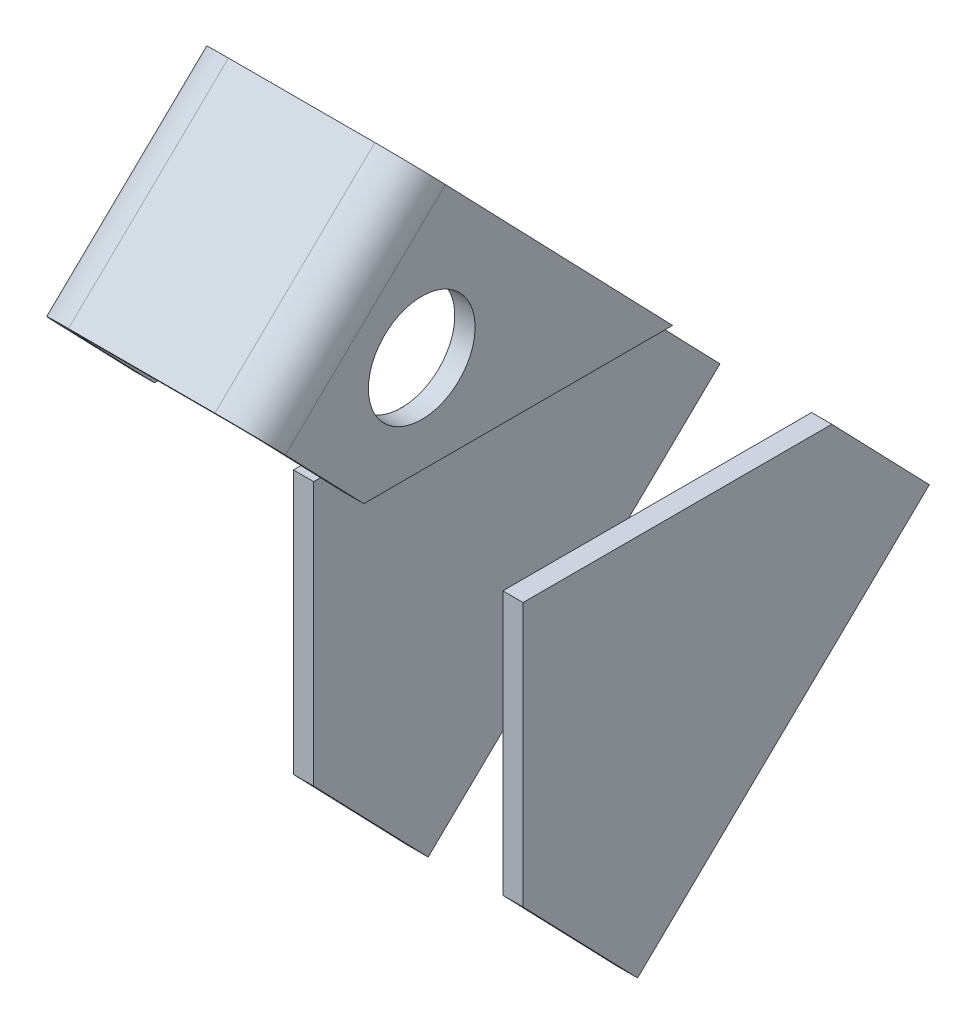
ISO-10303-21;
HEADER;
FILE_DESCRIPTION(('STEP AP214'),'2;1');
FILE_NAME('part.step','',(''),(''),'','','');
FILE_SCHEMA(('AUTOMOTIVE_DESIGN { 1 0 10303 214 1 1 1 1 }'));
ENDSEC;
DATA;
#1=APPLICATION_CONTEXT('core data for automotive mechanical design processes');
#2=APPLICATION_PROTOCOL_DEFINITION('international standard','automotive_design',2000,#1);
#3=PRODUCT_CONTEXT('',#1,'mechanical');
#4=PRODUCT('Part','Part','',(#3));
#5=PRODUCT_RELATED_PRODUCT_CATEGORY('part','',(#4));
#6=PRODUCT_DEFINITION_FORMATION('','',#4);
#7=PRODUCT_DEFINITION_CONTEXT('part definition',#1,'design');
#8=PRODUCT_DEFINITION('design','',#6,#7);
#9=PRODUCT_DEFINITION_SHAPE('','',#8);
#10=(LENGTH_UNIT() NAMED_UNIT(*) SI_UNIT(.MILLI.,.METRE.));
#11=(NAMED_UNIT(*) PLANE_ANGLE_UNIT() SI_UNIT($,.RADIAN.));
#12=(NAMED_UNIT(*) SI_UNIT($,.STERADIAN.) SOLID_ANGLE_UNIT());
#13=UNCERTAINTY_MEASURE_WITH_UNIT(LENGTH_MEASURE(1.E-05),#10,'distance_accuracy_value','');
#14=(GEOMETRIC_REPRESENTATION_CONTEXT(3) GLOBAL_UNCERTAINTY_ASSIGNED_CONTEXT((#13)) GLOBAL_UNIT_ASSIGNED_CONTEXT((#10,
#11,#12)) REPRESENTATION_CONTEXT('',''));
#15=CARTESIAN_POINT('',(0.,0.,0.));
#16=DIRECTION('',(0.,0.,1.));
#17=DIRECTION('',(1.,0.,0.));
#18=AXIS2_PLACEMENT_3D('',#15,#16,#17);
#19=CARTESIAN_POINT('',(8.89000000000001,15.8207765332516,-9.03289372808891));
#20=DIRECTION('',(-1.,0.,0.));
#21=DIRECTION('',(0.,0.,1.));
#22=AXIS2_PLACEMENT_3D('',#19,#20,#21);
#23=PLANE('',#22);
#24=DIRECTION('',(0.,0.,-1.));
#25=VECTOR('',#24,1.);
#26=CARTESIAN_POINT('',(8.89,-9.14399999999982,-9.03289372808891));
#27=LINE('',#26,#25);
#28=CARTESIAN_POINT('',(8.89000000000142,-9.14399999999982,-4.0757771941895));
#29=VERTEX_POINT('',#28);
#30=CARTESIAN_POINT('',(8.89000000000001,-9.14399999999982,-33.1021599719766));
#31=VERTEX_POINT('',#30);
#32=EDGE_CURVE('E12',#29,#31,#27,.T.);
#33=ORIENTED_EDGE('',*,*,#32,.F.);
#34=DIRECTION('',(0.,-0.719900647693354,-0.694077126442508));
#35=VECTOR('',#34,1.);
#36=CARTESIAN_POINT('',(8.88999999999544,38.2810780503455,41.6481181793793));
#37=LINE('',#36,#35);
#38=CARTESIAN_POINT('',(8.89,-1.4987000458035,3.29527857580048));
#39=VERTEX_POINT('',#38);
#40=EDGE_CURVE('E159',#39,#29,#37,.T.);
#41=ORIENTED_EDGE('',*,*,#40,.F.);
#42=DIRECTION('',(0.,-0.694077126442508,0.719900647693354));
#43=VECTOR('',#42,1.);
#44=CARTESIAN_POINT('',(8.89000000000001,13.0048131597343,-11.7478458158814));
#45=LINE('',#44,#43);
#46=CARTESIAN_POINT('',(8.89000000000001,13.0048131597343,-11.7478458158814));
#47=VERTEX_POINT('',#46);
#48=EDGE_CURVE('E199',#47,#39,#45,.T.);
#49=ORIENTED_EDGE('',*,*,#48,.F.);
#50=DIRECTION('',(0.,-0.719900647693354,-0.694077126442508));
#51=VECTOR('',#50,1.);
#52=CARTESIAN_POINT('',(8.89000000000001,15.8207765332516,-9.03289372808891));
#53=LINE('',#52,#51);
#54=EDGE_CURVE('E284',#47,#31,#53,.T.);
#55=ORIENTED_EDGE('',*,*,#54,.T.);
#56=EDGE_LOOP('',(#33,#41,#49,#55));
#57=FACE_BOUND('',#56,.T.);
#58=CARTESIAN_POINT('',(8.89,0.,-9.52499999999989));
#59=DIRECTION('',(-1.,0.,0.));
#60=DIRECTION('',(0.,0.,1.));
#61=AXIS2_PLACEMENT_3D('',#58,#59,#60);
#62=CIRCLE('',#61,5.01649999999967);
#63=CARTESIAN_POINT('',(8.89,0.,-4.50850000000022));
#64=VERTEX_POINT('',#63);
#65=EDGE_CURVE('E269',#64,#64,#62,.T.);
#66=ORIENTED_EDGE('',*,*,#65,.F.);
#67=EDGE_LOOP('',(#66));
#68=FACE_BOUND('',#67,.T.);
#69=ADVANCED_FACE('F54',(#57,#68),#23,.T.);
#70=CARTESIAN_POINT('',(-8.88999999999999,-34.1810159584776,-57.2410743441687));
#71=DIRECTION('',(1.,0.,0.));
#72=DIRECTION('',(0.,0.,-1.));
#73=AXIS2_PLACEMENT_3D('',#70,#71,#72);
#74=PLANE('',#73);
#75=DIRECTION('',(0.,0.,1.));
#76=VECTOR('',#75,1.);
#77=CARTESIAN_POINT('',(-8.88999999999998,-9.14399999999982,-57.2410743441687));
#78=LINE('',#77,#76);
#79=CARTESIAN_POINT('',(-8.88999999999999,-9.14399999999982,-33.1021599719766));
#80=VERTEX_POINT('',#79);
#81=CARTESIAN_POINT('',(-8.88999999999961,-9.14399999999981,-4.07577719418947));
#82=VERTEX_POINT('',#81);
#83=EDGE_CURVE('E92',#80,#82,#78,.T.);
#84=ORIENTED_EDGE('',*,*,#83,.F.);
#85=DIRECTION('',(0.,0.719900647693354,0.694077126442508));
#86=VECTOR('',#85,1.);
#87=CARTESIAN_POINT('',(-8.88999999999999,-34.1810159584776,-57.2410743441687));
#88=LINE('',#87,#86);
#89=CARTESIAN_POINT('',(-8.88999999999999,13.0048131597343,-11.7478458158814));
#90=VERTEX_POINT('',#89);
#91=EDGE_CURVE('E218',#80,#90,#88,.T.);
#92=ORIENTED_EDGE('',*,*,#91,.T.);
#93=DIRECTION('',(0.,-0.694077126442508,0.719900647693354));
#94=VECTOR('',#93,1.);
#95=CARTESIAN_POINT('',(-8.88999999999999,13.0048131597343,-11.7478458158814));
#96=LINE('',#95,#94);
#97=CARTESIAN_POINT('',(-8.89,-1.49870004580349,3.29527857580048));
#98=VERTEX_POINT('',#97);
#99=EDGE_CURVE('E214',#90,#98,#96,.T.);
#100=ORIENTED_EDGE('',*,*,#99,.T.);
#101=DIRECTION('',(0.,0.719900647693355,0.694077126442507));
#102=VECTOR('',#101,1.);
#103=CARTESIAN_POINT('',(-8.88999999999961,-24.6753470015359,-19.05));
#104=LINE('',#103,#102);
#105=EDGE_CURVE('E178',#82,#98,#104,.T.);
#106=ORIENTED_EDGE('',*,*,#105,.F.);
#107=EDGE_LOOP('',(#84,#92,#100,#106));
#108=FACE_BOUND('',#107,.T.);
#109=CARTESIAN_POINT('',(-8.88999999999999,-1.55626864766167E-12,-9.52499999999989));
#110=DIRECTION('',(1.,0.,0.));
#111=DIRECTION('',(0.,0.,-1.));
#112=AXIS2_PLACEMENT_3D('',#109,#110,#111);
#113=CIRCLE('',#112,5.01649999999967);
#114=CARTESIAN_POINT('',(-8.88999999999999,-1.55626864766167E-12,-14.5414999999996));
#115=VERTEX_POINT('',#114);
#116=EDGE_CURVE('E272',#115,#115,#113,.T.);
#117=ORIENTED_EDGE('',*,*,#116,.F.);
#118=EDGE_LOOP('',(#117));
#119=FACE_BOUND('',#118,.T.);
#120=ADVANCED_FACE('F56',(#108,#119),#74,.T.);
#121=CARTESIAN_POINT('',(-10.795,-34.1810159584776,-57.2410743441687));
#122=DIRECTION('',(1.,0.,0.));
#123=DIRECTION('',(0.,0.,-1.));
#124=AXIS2_PLACEMENT_3D('',#121,#122,#123);
#125=PLANE('',#124);
#126=CARTESIAN_POINT('',(-10.795,-1.72458567807043E-12,-9.52499999999989));
#127=DIRECTION('',(1.,0.,0.));
#128=DIRECTION('',(0.,0.,-1.));
#129=AXIS2_PLACEMENT_3D('',#126,#127,#128);
#130=CIRCLE('',#129,5.01649999999967);
#131=CARTESIAN_POINT('',(-10.795,-1.72458567807043E-12,-14.5414999999996));
#132=VERTEX_POINT('',#131);
#133=EDGE_CURVE('E217',#132,#132,#130,.T.);
#134=ORIENTED_EDGE('',*,*,#133,.T.);
#135=EDGE_LOOP('',(#134));
#136=FACE_BOUND('',#135,.T.);
#137=DIRECTION('',(0.,0.719900647693355,0.694077126442508));
#138=VECTOR('',#137,1.);
#139=CARTESIAN_POINT('',(-10.795,-34.1810159584776,-57.2410743441687));
#140=LINE('',#139,#138);
#141=CARTESIAN_POINT('',(-10.795,-9.14399999999982,-33.1021599719766));
#142=VERTEX_POINT('',#141);
#143=CARTESIAN_POINT('',(-10.795,13.0048131597343,-11.7478458158814));
#144=VERTEX_POINT('',#143);
#145=EDGE_CURVE('E58',#142,#144,#140,.T.);
#146=ORIENTED_EDGE('',*,*,#145,.F.);
#147=DIRECTION('',(0.,0.,1.));
#148=VECTOR('',#147,1.);
#149=CARTESIAN_POINT('',(-10.795,-9.14399999999982,-57.2410743441687));
#150=LINE('',#149,#148);
#151=CARTESIAN_POINT('',(-10.795,-9.14399999999982,-4.07577719418947));
#152=VERTEX_POINT('',#151);
#153=EDGE_CURVE('E278',#142,#152,#150,.T.);
#154=ORIENTED_EDGE('',*,*,#153,.T.);
#155=DIRECTION('',(0.,0.719900647693355,0.694077126442507));
#156=VECTOR('',#155,1.);
#157=CARTESIAN_POINT('',(-10.7949999999996,-24.6753470015359,-19.05));
#158=LINE('',#157,#156);
#159=CARTESIAN_POINT('',(-10.795,-1.4987000458035,3.29527857580048));
#160=VERTEX_POINT('',#159);
#161=EDGE_CURVE('E169',#152,#160,#158,.T.);
#162=ORIENTED_EDGE('',*,*,#161,.T.);
#163=DIRECTION('',(0.,-0.694077126442508,0.719900647693354));
#164=VECTOR('',#163,1.);
#165=CARTESIAN_POINT('',(-10.795,13.0048131597343,-11.7478458158814));
#166=LINE('',#165,#164);
#167=EDGE_CURVE('E210',#144,#160,#166,.T.);
#168=ORIENTED_EDGE('',*,*,#167,.F.);
#169=EDGE_LOOP('',(#146,#154,#162,#168));
#170=FACE_BOUND('',#169,.T.);
#171=ADVANCED_FACE('F336',(#136,#170),#125,.F.);
#172=CARTESIAN_POINT('',(10.795,15.8207765332516,-9.03289372808891));
#173=DIRECTION('',(-1.,0.,0.));
#174=DIRECTION('',(0.,0.,1.));
#175=AXIS2_PLACEMENT_3D('',#172,#173,#174);
#176=PLANE('',#175);
#177=CARTESIAN_POINT('',(10.795,1.83007333228881E-13,-9.52499999999989));
#178=DIRECTION('',(-1.,0.,0.));
#179=DIRECTION('',(0.,0.,1.));
#180=AXIS2_PLACEMENT_3D('',#177,#178,#179);
#181=CIRCLE('',#180,5.01649999999967);
#182=CARTESIAN_POINT('',(10.795,1.83007333228881E-13,-4.50850000000022));
#183=VERTEX_POINT('',#182);
#184=EDGE_CURVE('E165',#183,#183,#181,.T.);
#185=ORIENTED_EDGE('',*,*,#184,.T.);
#186=EDGE_LOOP('',(#185));
#187=FACE_BOUND('',#186,.T.);
#188=DIRECTION('',(0.,-0.719900647693354,-0.694077126442508));
#189=VECTOR('',#188,1.);
#190=CARTESIAN_POINT('',(10.7949999999954,38.2810780503456,41.6481181793794));
#191=LINE('',#190,#189);
#192=CARTESIAN_POINT('',(10.795,-1.49870004580349,3.29527857580047));
#193=VERTEX_POINT('',#192);
#194=CARTESIAN_POINT('',(10.7950000000014,-9.14399999999983,-4.07577719418951));
#195=VERTEX_POINT('',#194);
#196=EDGE_CURVE('E156',#193,#195,#191,.T.);
#197=ORIENTED_EDGE('',*,*,#196,.T.);
#198=DIRECTION('',(0.,0.,1.));
#199=VECTOR('',#198,1.);
#200=CARTESIAN_POINT('',(10.795,-9.14399999999982,-57.2410743441687));
#201=LINE('',#200,#199);
#202=CARTESIAN_POINT('',(10.795,-9.14399999999982,-33.1021599719766));
#203=VERTEX_POINT('',#202);
#204=EDGE_CURVE('E145',#203,#195,#201,.T.);
#205=ORIENTED_EDGE('',*,*,#204,.F.);
#206=DIRECTION('',(0.,-0.719900647693355,-0.694077126442508));
#207=VECTOR('',#206,1.);
#208=CARTESIAN_POINT('',(10.795,15.8207765332516,-9.03289372808891));
#209=LINE('',#208,#207);
#210=CARTESIAN_POINT('',(10.795,13.0048131597343,-11.7478458158814));
#211=VERTEX_POINT('',#210);
#212=EDGE_CURVE('E191',#211,#203,#209,.T.);
#213=ORIENTED_EDGE('',*,*,#212,.F.);
#214=DIRECTION('',(0.,-0.694077126442508,0.719900647693354));
#215=VECTOR('',#214,1.);
#216=CARTESIAN_POINT('',(10.795,13.0048131597343,-11.7478458158814));
#217=LINE('',#216,#215);
#218=EDGE_CURVE('E164',#211,#193,#217,.T.);
#219=ORIENTED_EDGE('',*,*,#218,.T.);
#220=EDGE_LOOP('',(#197,#205,#213,#219));
#221=FACE_BOUND('',#220,.T.);
#222=ADVANCED_FACE('F162',(#187,#221),#176,.F.);
#223=CARTESIAN_POINT('',(-6.88339999999999,14.4493657993958,-10.3551106539619));
#224=DIRECTION('',(0.,0.694077126442508,-0.719900647693355));
#225=DIRECTION('',(0.,0.719900647693355,0.694077126442508));
#226=AXIS2_PLACEMENT_3D('',#223,#224,#225);
#227=PLANE('',#226);
#228=DIRECTION('',(1.,0.,0.));
#229=VECTOR('',#228,1.);
#230=CARTESIAN_POINT('',(-6.88339999999997,-9.14399999999982,-33.1021599719766));
#231=LINE('',#230,#229);
#232=EDGE_CURVE('E275',#142,#80,#231,.T.);
#233=ORIENTED_EDGE('',*,*,#232,.F.);
#234=ORIENTED_EDGE('',*,*,#145,.T.);
#235=DIRECTION('',(1.,0.,0.));
#236=VECTOR('',#235,1.);
#237=CARTESIAN_POINT('',(-10.795,13.0048131597343,-11.7478458158814));
#238=LINE('',#237,#236);
#239=EDGE_CURVE('E188',#144,#90,#238,.T.);
#240=ORIENTED_EDGE('',*,*,#239,.T.);
#241=ORIENTED_EDGE('',*,*,#91,.F.);
#242=EDGE_LOOP('',(#233,#234,#240,#241));
#243=FACE_BOUND('',#242,.T.);
#244=ADVANCED_FACE('F294',(#243),#227,.T.);
#245=CARTESIAN_POINT('',(6.88340000000001,13.0048131597343,-11.7478458158814));
#246=DIRECTION('',(0.,-0.694077126442508,0.719900647693355));
#247=DIRECTION('',(0.,-0.719900647693355,-0.694077126442508));
#248=AXIS2_PLACEMENT_3D('',#245,#246,#247);
#249=PLANE('',#248);
#250=ORIENTED_EDGE('',*,*,#212,.T.);
#251=DIRECTION('',(-1.,0.,0.));
#252=VECTOR('',#251,1.);
#253=CARTESIAN_POINT('',(6.88340000000002,-9.14399999999982,-33.1021599719766));
#254=LINE('',#253,#252);
#255=EDGE_CURVE('E72',#203,#31,#254,.T.);
#256=ORIENTED_EDGE('',*,*,#255,.T.);
#257=ORIENTED_EDGE('',*,*,#54,.F.);
#258=DIRECTION('',(1.,0.,0.));
#259=VECTOR('',#258,1.);
#260=CARTESIAN_POINT('',(8.89000000000001,13.0048131597343,-11.7478458158814));
#261=LINE('',#260,#259);
#262=EDGE_CURVE('E198',#47,#211,#261,.T.);
#263=ORIENTED_EDGE('',*,*,#262,.T.);
#264=EDGE_LOOP('',(#250,#256,#257,#263));
#265=FACE_BOUND('',#264,.T.);
#266=ADVANCED_FACE('F321',(#265),#249,.F.);
#267=CARTESIAN_POINT('',(6.88340000000001,13.0048131597343,-11.7478458158814));
#268=DIRECTION('',(0.,-0.694077126442508,0.719900647693354));
#269=DIRECTION('',(0.,-0.719900647693354,-0.694077126442508));
#270=AXIS2_PLACEMENT_3D('',#267,#268,#269);
#271=CYLINDRICAL_SURFACE('',#270,2.0066);
#272=ORIENTED_EDGE('',*,*,#48,.T.);
#273=CARTESIAN_POINT('',(6.8834,-1.49870004580349,3.29527857580047));
#274=DIRECTION('',(0.,-0.694077126442508,0.719900647693354));
#275=DIRECTION('',(0.,-0.719900647693354,-0.694077126442508));
#276=AXIS2_PLACEMENT_3D('',#273,#274,#275);
#277=CIRCLE('',#276,2.0066);
#278=CARTESIAN_POINT('',(6.8834,-0.0541474061420133,4.68801373772002));
#279=VERTEX_POINT('',#278);
#280=EDGE_CURVE('E173',#279,#39,#277,.F.);
#281=ORIENTED_EDGE('',*,*,#280,.F.);
#282=DIRECTION('',(0.,-0.694077126442508,0.719900647693354));
#283=VECTOR('',#282,1.);
#284=CARTESIAN_POINT('',(6.88340000000001,14.4493657993958,-10.3551106539619));
#285=LINE('',#284,#283);
#286=CARTESIAN_POINT('',(6.88340000000001,14.4493657993958,-10.3551106539619));
#287=VERTEX_POINT('',#286);
#288=EDGE_CURVE('E224',#287,#279,#285,.T.);
#289=ORIENTED_EDGE('',*,*,#288,.F.);
#290=CARTESIAN_POINT('',(6.88340000000001,13.0048131597343,-11.7478458158814));
#291=DIRECTION('',(0.,-0.694077126442508,0.719900647693354));
#292=DIRECTION('',(1.,0.,0.));
#293=AXIS2_PLACEMENT_3D('',#290,#291,#292);
#294=CIRCLE('',#293,2.0066);
#295=EDGE_CURVE('E227',#287,#47,#294,.F.);
#296=ORIENTED_EDGE('',*,*,#295,.T.);
#297=EDGE_LOOP('',(#272,#281,#289,#296));
#298=FACE_BOUND('',#297,.T.);
#299=ADVANCED_FACE('F315',(#298),#271,.F.);
#300=CARTESIAN_POINT('',(-10.795,14.4493657993958,-10.3551106539619));
#301=DIRECTION('',(0.,-0.719900647693354,-0.694077126442508));
#302=DIRECTION('',(0.,0.694077126442508,-0.719900647693354));
#303=AXIS2_PLACEMENT_3D('',#300,#301,#302);
#304=PLANE('',#303);
#305=ORIENTED_EDGE('',*,*,#288,.T.);
#306=DIRECTION('',(1.,0.,0.));
#307=VECTOR('',#306,1.);
#308=CARTESIAN_POINT('',(-43.7257733088593,-0.0541474061420983,4.68801373771993));
#309=LINE('',#308,#307);
#310=CARTESIAN_POINT('',(-6.8834,-0.054147406142015,4.68801373772002));
#311=VERTEX_POINT('',#310);
#312=EDGE_CURVE('E258',#311,#279,#309,.T.);
#313=ORIENTED_EDGE('',*,*,#312,.F.);
#314=DIRECTION('',(0.,-0.694077126442508,0.719900647693354));
#315=VECTOR('',#314,1.);
#316=CARTESIAN_POINT('',(-6.88339999999999,14.4493657993958,-10.3551106539619));
#317=LINE('',#316,#315);
#318=CARTESIAN_POINT('',(-6.88339999999999,14.4493657993958,-10.3551106539619));
#319=VERTEX_POINT('',#318);
#320=EDGE_CURVE('E219',#319,#311,#317,.T.);
#321=ORIENTED_EDGE('',*,*,#320,.F.);
#322=DIRECTION('',(1.,0.,0.));
#323=VECTOR('',#322,1.);
#324=CARTESIAN_POINT('',(-10.795,14.4493657993958,-10.3551106539619));
#325=LINE('',#324,#323);
#326=EDGE_CURVE('E223',#319,#287,#325,.T.);
#327=ORIENTED_EDGE('',*,*,#326,.T.);
#328=EDGE_LOOP('',(#305,#313,#321,#327));
#329=FACE_BOUND('',#328,.T.);
#330=ADVANCED_FACE('F309',(#329),#304,.T.);
#331=CARTESIAN_POINT('',(-6.88339999999999,13.0048131597343,-11.7478458158814));
#332=DIRECTION('',(0.,-0.694077126442508,0.719900647693354));
#333=DIRECTION('',(0.,-0.719900647693354,-0.694077126442508));
#334=AXIS2_PLACEMENT_3D('',#331,#332,#333);
#335=CYLINDRICAL_SURFACE('',#334,2.0066);
#336=ORIENTED_EDGE('',*,*,#320,.T.);
#337=CARTESIAN_POINT('',(-6.88339999999963,-1.49870004580353,3.29527857580043));
#338=DIRECTION('',(0.,-0.694077126442508,0.719900647693354));
#339=DIRECTION('',(1.,0.,0.));
#340=AXIS2_PLACEMENT_3D('',#337,#338,#339);
#341=CIRCLE('',#340,2.0066);
#342=EDGE_CURVE('E302',#98,#311,#341,.F.);
#343=ORIENTED_EDGE('',*,*,#342,.F.);
#344=ORIENTED_EDGE('',*,*,#99,.F.);
#345=CARTESIAN_POINT('',(-6.88339999999999,13.0048131597343,-11.7478458158814));
#346=DIRECTION('',(0.,-0.694077126442508,0.719900647693354));
#347=DIRECTION('',(1.,0.,0.));
#348=AXIS2_PLACEMENT_3D('',#345,#346,#347);
#349=CIRCLE('',#348,2.0066);
#350=EDGE_CURVE('E222',#90,#319,#349,.F.);
#351=ORIENTED_EDGE('',*,*,#350,.T.);
#352=EDGE_LOOP('',(#336,#343,#344,#351));
#353=FACE_BOUND('',#352,.T.);
#354=ADVANCED_FACE('F301',(#353),#335,.F.);
#355=CARTESIAN_POINT('',(-6.88339999999999,13.0048131597343,-11.7478458158814));
#356=DIRECTION('',(0.,-0.694077126442508,0.719900647693354));
#357=DIRECTION('',(0.,-0.719900647693354,-0.694077126442508));
#358=AXIS2_PLACEMENT_3D('',#355,#356,#357);
#359=CYLINDRICAL_SURFACE('',#358,3.9116);
#360=CARTESIAN_POINT('',(-6.88339999999962,-1.49870004580354,3.29527857580043));
#361=DIRECTION('',(0.,0.694077126442517,-0.719900647693346));
#362=DIRECTION('',(-1.,0.,0.));
#363=AXIS2_PLACEMENT_3D('',#360,#361,#362);
#364=CIRCLE('',#363,3.9116);
#365=CARTESIAN_POINT('',(-6.8834,1.31726332771383,6.01023066359299));
#366=VERTEX_POINT('',#365);
#367=EDGE_CURVE('E213',#160,#366,#364,.T.);
#368=ORIENTED_EDGE('',*,*,#367,.T.);
#369=DIRECTION('',(0.,-0.694077126442508,0.719900647693354));
#370=VECTOR('',#369,1.);
#371=CARTESIAN_POINT('',(-6.88339999999999,15.8207765332516,-9.03289372808892));
#372=LINE('',#371,#370);
#373=CARTESIAN_POINT('',(-6.88339999999999,15.8207765332516,-9.03289372808892));
#374=VERTEX_POINT('',#373);
#375=EDGE_CURVE('E206',#374,#366,#372,.T.);
#376=ORIENTED_EDGE('',*,*,#375,.F.);
#377=CARTESIAN_POINT('',(-6.88339999999999,13.0048131597343,-11.7478458158814));
#378=DIRECTION('',(0.,-0.694077126442508,0.719900647693355));
#379=DIRECTION('',(0.,-0.719900647693355,-0.694077126442508));
#380=AXIS2_PLACEMENT_3D('',#377,#378,#379);
#381=CIRCLE('',#380,3.9116);
#382=EDGE_CURVE('E204',#144,#374,#381,.F.);
#383=ORIENTED_EDGE('',*,*,#382,.F.);
#384=ORIENTED_EDGE('',*,*,#167,.T.);
#385=EDGE_LOOP('',(#368,#376,#383,#384));
#386=FACE_BOUND('',#385,.T.);
#387=ADVANCED_FACE('F353',(#386),#359,.T.);
#388=CARTESIAN_POINT('',(-10.795,15.8207765332516,-9.03289372808892));
#389=DIRECTION('',(0.,-0.719900647693354,-0.694077126442508));
#390=DIRECTION('',(0.,0.694077126442508,-0.719900647693354));
#391=AXIS2_PLACEMENT_3D('',#388,#389,#390);
#392=PLANE('',#391);
#393=DIRECTION('',(1.,0.,0.));
#394=VECTOR('',#393,1.);
#395=CARTESIAN_POINT('',(-43.7257733088593,1.31726332771375,6.01023066359291));
#396=LINE('',#395,#394);
#397=CARTESIAN_POINT('',(6.8834,1.31726332771383,6.010230663593));
#398=VERTEX_POINT('',#397);
#399=EDGE_CURVE('E209',#366,#398,#396,.T.);
#400=ORIENTED_EDGE('',*,*,#399,.T.);
#401=DIRECTION('',(0.,-0.694077126442508,0.719900647693354));
#402=VECTOR('',#401,1.);
#403=CARTESIAN_POINT('',(6.88340000000001,15.8207765332516,-9.03289372808891));
#404=LINE('',#403,#402);
#405=CARTESIAN_POINT('',(6.88340000000001,15.8207765332516,-9.03289372808891));
#406=VERTEX_POINT('',#405);
#407=EDGE_CURVE('E201',#406,#398,#404,.T.);
#408=ORIENTED_EDGE('',*,*,#407,.F.);
#409=DIRECTION('',(1.,0.,0.));
#410=VECTOR('',#409,1.);
#411=CARTESIAN_POINT('',(-10.795,15.8207765332516,-9.03289372808892));
#412=LINE('',#411,#410);
#413=EDGE_CURVE('E197',#374,#406,#412,.T.);
#414=ORIENTED_EDGE('',*,*,#413,.F.);
#415=ORIENTED_EDGE('',*,*,#375,.T.);
#416=EDGE_LOOP('',(#400,#408,#414,#415));
#417=FACE_BOUND('',#416,.T.);
#418=ADVANCED_FACE('F261',(#417),#392,.F.);
#419=CARTESIAN_POINT('',(6.88340000000001,13.0048131597343,-11.7478458158814));
#420=DIRECTION('',(0.,-0.694077126442508,0.719900647693354));
#421=DIRECTION('',(0.,-0.719900647693354,-0.694077126442508));
#422=AXIS2_PLACEMENT_3D('',#419,#420,#421);
#423=CYLINDRICAL_SURFACE('',#422,3.9116);
#424=CARTESIAN_POINT('',(6.8834,-1.49870004580349,3.29527857580047));
#425=DIRECTION('',(0.,0.694077126442507,-0.719900647693355));
#426=DIRECTION('',(0.,0.719900647693355,0.694077126442507));
#427=AXIS2_PLACEMENT_3D('',#424,#425,#426);
#428=CIRCLE('',#427,3.9116);
#429=EDGE_CURVE('E205',#398,#193,#428,.T.);
#430=ORIENTED_EDGE('',*,*,#429,.T.);
#431=ORIENTED_EDGE('',*,*,#218,.F.);
#432=CARTESIAN_POINT('',(6.88340000000001,13.0048131597343,-11.7478458158814));
#433=DIRECTION('',(0.,-0.694077126442508,0.719900647693355));
#434=DIRECTION('',(0.,-0.719900647693355,-0.694077126442508));
#435=AXIS2_PLACEMENT_3D('',#432,#433,#434);
#436=CIRCLE('',#435,3.9116);
#437=EDGE_CURVE('E238',#406,#211,#436,.F.);
#438=ORIENTED_EDGE('',*,*,#437,.F.);
#439=ORIENTED_EDGE('',*,*,#407,.T.);
#440=EDGE_LOOP('',(#430,#431,#438,#439));
#441=FACE_BOUND('',#440,.T.);
#442=ADVANCED_FACE('F244',(#441),#423,.T.);
#443=CARTESIAN_POINT('',(-10.795,13.0048131597343,-11.7478458158814));
#444=DIRECTION('',(0.,0.694077126442508,-0.719900647693355));
#445=DIRECTION('',(0.,0.719900647693355,0.694077126442508));
#446=AXIS2_PLACEMENT_3D('',#443,#444,#445);
#447=PLANE('',#446);
#448=ORIENTED_EDGE('',*,*,#239,.F.);
#449=ORIENTED_EDGE('',*,*,#382,.T.);
#450=DIRECTION('',(0.,0.719900647693355,0.694077126442507));
#451=VECTOR('',#450,1.);
#452=CARTESIAN_POINT('',(-6.88339999999999,14.4493657993958,-10.3551106539619));
#453=LINE('',#452,#451);
#454=EDGE_CURVE('E192',#319,#374,#453,.T.);
#455=ORIENTED_EDGE('',*,*,#454,.F.);
#456=ORIENTED_EDGE('',*,*,#350,.F.);
#457=EDGE_LOOP('',(#448,#449,#455,#456));
#458=FACE_BOUND('',#457,.T.);
#459=ADVANCED_FACE('F303',(#458),#447,.T.);
#460=CARTESIAN_POINT('',(6.88340000000001,15.8207765332516,-9.03289372808891));
#461=DIRECTION('',(0.,0.694077126442508,-0.719900647693355));
#462=DIRECTION('',(0.,0.719900647693355,0.694077126442508));
#463=AXIS2_PLACEMENT_3D('',#460,#461,#462);
#464=PLANE('',#463);
#465=DIRECTION('',(0.,-0.719900647693354,-0.694077126442508));
#466=VECTOR('',#465,1.);
#467=CARTESIAN_POINT('',(6.88340000000001,15.8207765332516,-9.03289372808891));
#468=LINE('',#467,#466);
#469=EDGE_CURVE('E195',#406,#287,#468,.T.);
#470=ORIENTED_EDGE('',*,*,#469,.F.);
#471=ORIENTED_EDGE('',*,*,#437,.T.);
#472=ORIENTED_EDGE('',*,*,#262,.F.);
#473=ORIENTED_EDGE('',*,*,#295,.F.);
#474=EDGE_LOOP('',(#470,#471,#472,#473));
#475=FACE_BOUND('',#474,.T.);
#476=ADVANCED_FACE('F322',(#475),#464,.T.);
#477=CARTESIAN_POINT('',(8.89000000000001,13.0048131597343,-11.7478458158814));
#478=DIRECTION('',(0.,0.694077126442508,-0.719900647693355));
#479=DIRECTION('',(0.,0.719900647693355,0.694077126442508));
#480=AXIS2_PLACEMENT_3D('',#477,#478,#479);
#481=PLANE('',#480);
#482=ORIENTED_EDGE('',*,*,#413,.T.);
#483=ORIENTED_EDGE('',*,*,#469,.T.);
#484=ORIENTED_EDGE('',*,*,#326,.F.);
#485=ORIENTED_EDGE('',*,*,#454,.T.);
#486=EDGE_LOOP('',(#482,#483,#484,#485));
#487=FACE_BOUND('',#486,.T.);
#488=ADVANCED_FACE('F311',(#487),#481,.T.);
#489=CARTESIAN_POINT('',(6.8834,-1.49870004580349,3.29527857580047));
#490=DIRECTION('',(0.,-0.694077126442507,0.719900647693355));
#491=DIRECTION('',(0.,-0.719900647693355,-0.694077126442507));
#492=AXIS2_PLACEMENT_3D('',#489,#490,#491);
#493=PLANE('',#492);
#494=DIRECTION('',(0.,-0.719900647693355,-0.694077126442507));
#495=VECTOR('',#494,1.);
#496=CARTESIAN_POINT('',(6.88340000000038,1.31726332771382,6.01023066359298));
#497=LINE('',#496,#495);
#498=EDGE_CURVE('E194',#398,#279,#497,.T.);
#499=ORIENTED_EDGE('',*,*,#498,.T.);
#500=ORIENTED_EDGE('',*,*,#280,.T.);
#501=DIRECTION('',(1.,0.,0.));
#502=VECTOR('',#501,1.);
#503=CARTESIAN_POINT('',(8.89000000000046,-1.49870004580351,3.29527857580047));
#504=LINE('',#503,#502);
#505=EDGE_CURVE('E179',#39,#193,#504,.T.);
#506=ORIENTED_EDGE('',*,*,#505,.T.);
#507=ORIENTED_EDGE('',*,*,#429,.F.);
#508=EDGE_LOOP('',(#499,#500,#506,#507));
#509=FACE_BOUND('',#508,.T.);
#510=ADVANCED_FACE('F250',(#509),#493,.T.);
#511=CARTESIAN_POINT('',(8.88999999999544,38.2810780503455,41.6481181793793));
#512=DIRECTION('',(0.,0.694077126442508,-0.719900647693354));
#513=DIRECTION('',(0.,-0.719900647693354,-0.694077126442508));
#514=AXIS2_PLACEMENT_3D('',#511,#512,#513);
#515=PLANE('',#514);
#516=DIRECTION('',(1.,0.,0.));
#517=VECTOR('',#516,1.);
#518=CARTESIAN_POINT('',(8.88999999999546,-9.14399999999982,-4.0757771941895));
#519=LINE('',#518,#517);
#520=EDGE_CURVE('E64',#195,#29,#519,.F.);
#521=ORIENTED_EDGE('',*,*,#520,.F.);
#522=ORIENTED_EDGE('',*,*,#196,.F.);
#523=ORIENTED_EDGE('',*,*,#505,.F.);
#524=ORIENTED_EDGE('',*,*,#40,.T.);
#525=EDGE_LOOP('',(#521,#522,#523,#524));
#526=FACE_BOUND('',#525,.T.);
#527=ADVANCED_FACE('F154',(#526),#515,.F.);
#528=CARTESIAN_POINT('',(-8.88999999999961,-24.6753470015359,-19.05));
#529=DIRECTION('',(0.,0.694077126442508,-0.719900647693355));
#530=DIRECTION('',(0.,0.719900647693355,0.694077126442507));
#531=AXIS2_PLACEMENT_3D('',#528,#529,#530);
#532=PLANE('',#531);
#533=DIRECTION('',(1.,0.,0.));
#534=VECTOR('',#533,1.);
#535=CARTESIAN_POINT('',(-8.88999999999962,-9.14399999999982,-4.07577719418947));
#536=LINE('',#535,#534);
#537=EDGE_CURVE('E86',#82,#152,#536,.F.);
#538=ORIENTED_EDGE('',*,*,#537,.F.);
#539=ORIENTED_EDGE('',*,*,#105,.T.);
#540=DIRECTION('',(1.,0.,0.));
#541=VECTOR('',#540,1.);
#542=CARTESIAN_POINT('',(-10.7949999999996,-1.49870004580353,3.29527857580045));
#543=LINE('',#542,#541);
#544=EDGE_CURVE('E186',#160,#98,#543,.T.);
#545=ORIENTED_EDGE('',*,*,#544,.F.);
#546=ORIENTED_EDGE('',*,*,#161,.F.);
#547=EDGE_LOOP('',(#538,#539,#545,#546));
#548=FACE_BOUND('',#547,.T.);
#549=ADVANCED_FACE('F363',(#548),#532,.F.);
#550=CARTESIAN_POINT('',(-6.88339999999962,-1.49870004580354,3.29527857580043));
#551=DIRECTION('',(0.,-0.694077126442517,0.719900647693346));
#552=DIRECTION('',(1.,0.,0.));
#553=AXIS2_PLACEMENT_3D('',#550,#551,#552);
#554=PLANE('',#553);
#555=ORIENTED_EDGE('',*,*,#544,.T.);
#556=ORIENTED_EDGE('',*,*,#342,.T.);
#557=DIRECTION('',(0.,0.719900647693356,0.694077126442507));
#558=VECTOR('',#557,1.);
#559=CARTESIAN_POINT('',(-6.88339999999962,-0.0541474061420463,4.68801373771999));
#560=LINE('',#559,#558);
#561=EDGE_CURVE('E266',#311,#366,#560,.T.);
#562=ORIENTED_EDGE('',*,*,#561,.T.);
#563=ORIENTED_EDGE('',*,*,#367,.F.);
#564=EDGE_LOOP('',(#555,#556,#562,#563));
#565=FACE_BOUND('',#564,.T.);
#566=ADVANCED_FACE('F361',(#565),#554,.T.);
#567=CARTESIAN_POINT('',(-43.7257733088593,-0.0541474061420983,4.68801373771993));
#568=DIRECTION('',(0.,0.694077126442508,-0.719900647693355));
#569=DIRECTION('',(1.,0.,0.));
#570=AXIS2_PLACEMENT_3D('',#567,#568,#569);
#571=PLANE('',#570);
#572=ORIENTED_EDGE('',*,*,#498,.F.);
#573=ORIENTED_EDGE('',*,*,#399,.F.);
#574=ORIENTED_EDGE('',*,*,#561,.F.);
#575=ORIENTED_EDGE('',*,*,#312,.T.);
#576=EDGE_LOOP('',(#572,#573,#574,#575));
#577=FACE_BOUND('',#576,.T.);
#578=ADVANCED_FACE('F254',(#577),#571,.F.);
#579=CARTESIAN_POINT('',(10.7950250000014,1.83009542113918E-13,-9.52499999999989));
#580=DIRECTION('',(-1.,0.,0.));
#581=DIRECTION('',(0.,-1.,0.));
#582=AXIS2_PLACEMENT_3D('',#579,#580,#581);
#583=CYLINDRICAL_SURFACE('',#582,5.01649999999967);
#584=ORIENTED_EDGE('',*,*,#65,.T.);
#585=EDGE_LOOP('',(#584));
#586=FACE_BOUND('',#585,.T.);
#587=ORIENTED_EDGE('',*,*,#184,.F.);
#588=EDGE_LOOP('',(#587));
#589=FACE_BOUND('',#588,.T.);
#590=ADVANCED_FACE('F376',(#586,#589),#583,.F.);
#591=ORIENTED_EDGE('',*,*,#116,.T.);
#592=EDGE_LOOP('',(#591));
#593=FACE_BOUND('',#592,.T.);
#594=ORIENTED_EDGE('',*,*,#133,.F.);
#595=EDGE_LOOP('',(#594));
#596=FACE_BOUND('',#595,.T.);
#597=ADVANCED_FACE('F379',(#593,#596),#583,.F.);
#598=CARTESIAN_POINT('',(-10.795,-9.14399999999982,-57.2410743441687));
#599=DIRECTION('',(0.,1.,0.));
#600=DIRECTION('',(0.,0.,1.));
#601=AXIS2_PLACEMENT_3D('',#598,#599,#600);
#602=PLANE('',#601);
#603=ORIENTED_EDGE('',*,*,#232,.T.);
#604=ORIENTED_EDGE('',*,*,#83,.T.);
#605=ORIENTED_EDGE('',*,*,#537,.T.);
#606=ORIENTED_EDGE('',*,*,#153,.F.);
#607=EDGE_LOOP('',(#603,#604,#605,#606));
#608=FACE_BOUND('',#607,.T.);
#609=ADVANCED_FACE('F381',(#608),#602,.F.);
#610=ORIENTED_EDGE('',*,*,#204,.T.);
#611=ORIENTED_EDGE('',*,*,#520,.T.);
#612=ORIENTED_EDGE('',*,*,#32,.T.);
#613=ORIENTED_EDGE('',*,*,#255,.F.);
#614=EDGE_LOOP('',(#610,#611,#612,#613));
#615=FACE_BOUND('',#614,.T.);
#616=ADVANCED_FACE('F146',(#615),#602,.F.);
#617=CLOSED_SHELL('',(#69,#120,#171,#222,#244,#266,#299,#330,#354,#387,#418,#442,#459,#476,#488,
#510,#527,#549,#566,#578,#590,#597,#609,#616));
#618=MANIFOLD_SOLID_BREP('B2',#617);
#619=CARTESIAN_POINT('',(-8.88999999999999,-34.1810159584776,-57.2410743441687));
#620=DIRECTION('',(0.,0.719900647693354,0.694077126442508));
#621=DIRECTION('',(0.,-0.694077126442508,0.719900647693354));
#622=AXIS2_PLACEMENT_3D('',#619,#620,#621);
#623=PLANE('',#622);
#624=DIRECTION('',(-1.,0.,0.));
#625=VECTOR('',#624,1.);
#626=CARTESIAN_POINT('',(-8.89000000000001,-60.6253544759372,-29.8128596670518));
#627=LINE('',#626,#625);
#628=CARTESIAN_POINT('',(-8.89000000000001,-60.6253544759372,-29.8128596670518));
#629=VERTEX_POINT('',#628);
#630=CARTESIAN_POINT('',(-10.795,-60.6253544759372,-29.8128596670518));
#631=VERTEX_POINT('',#630);
#632=EDGE_CURVE('E671',#629,#631,#627,.T.);
#633=ORIENTED_EDGE('',*,*,#632,.T.);
#634=DIRECTION('',(0.,-0.694077126442508,0.719900647693354));
#635=VECTOR('',#634,1.);
#636=CARTESIAN_POINT('',(-10.795,-34.1810159584776,-57.2410743441687));
#637=LINE('',#636,#635);
#638=CARTESIAN_POINT('',(-10.795,-34.1810159584776,-57.2410743441687));
#639=VERTEX_POINT('',#638);
#640=EDGE_CURVE('E648',#639,#631,#637,.T.);
#641=ORIENTED_EDGE('',*,*,#640,.F.);
#642=DIRECTION('',(-1.,0.,0.));
#643=VECTOR('',#642,1.);
#644=CARTESIAN_POINT('',(-8.88999999999999,-34.1810159584776,-57.2410743441687));
#645=LINE('',#644,#643);
#646=CARTESIAN_POINT('',(-8.88999999999999,-34.1810159584776,-57.2410743441687));
#647=VERTEX_POINT('',#646);
#648=EDGE_CURVE('E658',#647,#639,#645,.T.);
#649=ORIENTED_EDGE('',*,*,#648,.F.);
#650=DIRECTION('',(0.,-0.694077126442508,0.719900647693354));
#651=VECTOR('',#650,1.);
#652=CARTESIAN_POINT('',(-8.88999999999999,-34.1810159584776,-57.2410743441687));
#653=LINE('',#652,#651);
#654=EDGE_CURVE('E692',#647,#629,#653,.T.);
#655=ORIENTED_EDGE('',*,*,#654,.T.);
#656=EDGE_LOOP('',(#633,#641,#649,#655));
#657=FACE_BOUND('',#656,.T.);
#658=ADVANCED_FACE('F597',(#657),#623,.F.);
#659=CARTESIAN_POINT('',(6.88339999999999,-13.4395253577252,15.6803688612354));
#660=DIRECTION('',(0.,-0.694077126442508,0.719900647693355));
#661=DIRECTION('',(0.,-0.719900647693355,-0.694077126442508));
#662=AXIS2_PLACEMENT_3D('',#659,#660,#661);
#663=PLANE('',#662);
#664=DIRECTION('',(0.,0.719900647693354,0.694077126442508));
#665=VECTOR('',#664,1.);
#666=CARTESIAN_POINT('',(-8.89000000000001,-60.6253544759372,-29.8128596670518));
#667=LINE('',#666,#665);
#668=CARTESIAN_POINT('',(-8.89000000000001,-49.4620566951032,-19.0500000000001));
#669=VERTEX_POINT('',#668);
#670=EDGE_CURVE('E657',#629,#669,#667,.T.);
#671=ORIENTED_EDGE('',*,*,#670,.T.);
#672=DIRECTION('',(1.,0.,0.));
#673=VECTOR('',#672,1.);
#674=CARTESIAN_POINT('',(-8.8899999999996,-49.4620566951032,-19.05));
#675=LINE('',#674,#673);
#676=CARTESIAN_POINT('',(-10.795,-49.4620566951032,-19.0500000000001));
#677=VERTEX_POINT('',#676);
#678=EDGE_CURVE('E642',#669,#677,#675,.F.);
#679=ORIENTED_EDGE('',*,*,#678,.T.);
#680=DIRECTION('',(0.,0.719900647693355,0.694077126442508));
#681=VECTOR('',#680,1.);
#682=CARTESIAN_POINT('',(-10.795,-60.6253544759372,-29.8128596670518));
#683=LINE('',#682,#681);
#684=EDGE_CURVE('E655',#631,#677,#683,.T.);
#685=ORIENTED_EDGE('',*,*,#684,.F.);
#686=ORIENTED_EDGE('',*,*,#632,.F.);
#687=EDGE_LOOP('',(#671,#679,#685,#686));
#688=FACE_BOUND('',#687,.T.);
#689=ADVANCED_FACE('F653',(#688),#663,.T.);
#690=CARTESIAN_POINT('',(-6.88339999999999,14.4493657993958,-10.3551106539619));
#691=DIRECTION('',(0.,0.694077126442508,-0.719900647693355));
#692=DIRECTION('',(0.,0.719900647693355,0.694077126442508));
#693=AXIS2_PLACEMENT_3D('',#690,#691,#692);
#694=PLANE('',#693);
#695=DIRECTION('',(-1.,0.,0.));
#696=VECTOR('',#695,1.);
#697=CARTESIAN_POINT('',(-6.88339999999996,-24.6753470015359,-48.0763827777871));
#698=LINE('',#697,#696);
#699=CARTESIAN_POINT('',(-8.88999999999999,-24.6753470015359,-48.0763827777871));
#700=VERTEX_POINT('',#699);
#701=CARTESIAN_POINT('',(-10.795,-24.6753470015359,-48.0763827777871));
#702=VERTEX_POINT('',#701);
#703=EDGE_CURVE('E667',#700,#702,#698,.T.);
#704=ORIENTED_EDGE('',*,*,#703,.F.);
#705=DIRECTION('',(0.,0.719900647693354,0.694077126442508));
#706=VECTOR('',#705,1.);
#707=CARTESIAN_POINT('',(-8.88999999999999,-34.1810159584776,-57.2410743441687));
#708=LINE('',#707,#706);
#709=EDGE_CURVE('E664',#647,#700,#708,.T.);
#710=ORIENTED_EDGE('',*,*,#709,.F.);
#711=ORIENTED_EDGE('',*,*,#648,.T.);
#712=DIRECTION('',(0.,0.719900647693355,0.694077126442508));
#713=VECTOR('',#712,1.);
#714=CARTESIAN_POINT('',(-10.795,-34.1810159584776,-57.2410743441687));
#715=LINE('',#714,#713);
#716=EDGE_CURVE('E675',#639,#702,#715,.T.);
#717=ORIENTED_EDGE('',*,*,#716,.T.);
#718=EDGE_LOOP('',(#704,#710,#711,#717));
#719=FACE_BOUND('',#718,.T.);
#720=ADVANCED_FACE('F688',(#719),#694,.T.);
#721=CARTESIAN_POINT('',(-8.88999999999961,-34.1810159584777,-19.05));
#722=DIRECTION('',(0.,0.,-1.));
#723=DIRECTION('',(0.,1.,0.));
#724=AXIS2_PLACEMENT_3D('',#721,#722,#723);
#725=PLANE('',#724);
#726=ORIENTED_EDGE('',*,*,#678,.F.);
#727=DIRECTION('',(0.,1.,0.));
#728=VECTOR('',#727,1.);
#729=CARTESIAN_POINT('',(-8.88999999999961,-34.1810159584777,-19.05));
#730=LINE('',#729,#728);
#731=CARTESIAN_POINT('',(-8.8899999999996,-24.6753470015359,-19.05));
#732=VERTEX_POINT('',#731);
#733=EDGE_CURVE('E677',#669,#732,#730,.T.);
#734=ORIENTED_EDGE('',*,*,#733,.T.);
#735=DIRECTION('',(1.,0.,0.));
#736=VECTOR('',#735,1.);
#737=CARTESIAN_POINT('',(-8.8899999999996,-24.6753470015359,-19.0500000000001));
#738=LINE('',#737,#736);
#739=CARTESIAN_POINT('',(-10.795,-24.6753470015359,-19.05));
#740=VERTEX_POINT('',#739);
#741=EDGE_CURVE('E644',#732,#740,#738,.F.);
#742=ORIENTED_EDGE('',*,*,#741,.T.);
#743=DIRECTION('',(0.,1.,0.));
#744=VECTOR('',#743,1.);
#745=CARTESIAN_POINT('',(-10.7949999999996,-34.1810159584777,-19.0500000000001));
#746=LINE('',#745,#744);
#747=EDGE_CURVE('E638',#677,#740,#746,.T.);
#748=ORIENTED_EDGE('',*,*,#747,.F.);
#749=EDGE_LOOP('',(#726,#734,#742,#748));
#750=FACE_BOUND('',#749,.T.);
#751=ADVANCED_FACE('F640',(#750),#725,.F.);
#752=CARTESIAN_POINT('',(-10.795,-34.1810159584776,-57.2410743441687));
#753=DIRECTION('',(1.,0.,0.));
#754=DIRECTION('',(0.,0.,-1.));
#755=AXIS2_PLACEMENT_3D('',#752,#753,#754);
#756=PLANE('',#755);
#757=ORIENTED_EDGE('',*,*,#747,.T.);
#758=DIRECTION('',(0.,0.,1.));
#759=VECTOR('',#758,1.);
#760=CARTESIAN_POINT('',(-10.795,-24.6753470015359,-57.2410743441687));
#761=LINE('',#760,#759);
#762=EDGE_CURVE('E601',#702,#740,#761,.T.);
#763=ORIENTED_EDGE('',*,*,#762,.F.);
#764=ORIENTED_EDGE('',*,*,#716,.F.);
#765=ORIENTED_EDGE('',*,*,#640,.T.);
#766=ORIENTED_EDGE('',*,*,#684,.T.);
#767=EDGE_LOOP('',(#757,#763,#764,#765,#766));
#768=FACE_BOUND('',#767,.T.);
#769=ADVANCED_FACE('F661',(#768),#756,.F.);
#770=CARTESIAN_POINT('',(-8.88999999999999,-34.1810159584776,-57.2410743441687));
#771=DIRECTION('',(1.,0.,0.));
#772=DIRECTION('',(0.,0.,-1.));
#773=AXIS2_PLACEMENT_3D('',#770,#771,#772);
#774=PLANE('',#773);
#775=DIRECTION('',(0.,0.,-1.));
#776=VECTOR('',#775,1.);
#777=CARTESIAN_POINT('',(-8.88999999999998,-24.6753470015359,-57.2410743441687));
#778=LINE('',#777,#776);
#779=EDGE_CURVE('E52',#732,#700,#778,.T.);
#780=ORIENTED_EDGE('',*,*,#779,.F.);
#781=ORIENTED_EDGE('',*,*,#733,.F.);
#782=ORIENTED_EDGE('',*,*,#670,.F.);
#783=ORIENTED_EDGE('',*,*,#654,.F.);
#784=ORIENTED_EDGE('',*,*,#709,.T.);
#785=EDGE_LOOP('',(#780,#781,#782,#783,#784));
#786=FACE_BOUND('',#785,.T.);
#787=ADVANCED_FACE('F695',(#786),#774,.T.);
#788=CARTESIAN_POINT('',(-10.795,-24.6753470015359,-57.2410743441687));
#789=DIRECTION('',(0.,-1.,0.));
#790=DIRECTION('',(0.,0.,-1.));
#791=AXIS2_PLACEMENT_3D('',#788,#789,#790);
#792=PLANE('',#791);
#793=ORIENTED_EDGE('',*,*,#703,.T.);
#794=ORIENTED_EDGE('',*,*,#762,.T.);
#795=ORIENTED_EDGE('',*,*,#741,.F.);
#796=ORIENTED_EDGE('',*,*,#779,.T.);
#797=EDGE_LOOP('',(#793,#794,#795,#796));
#798=FACE_BOUND('',#797,.T.);
#799=ADVANCED_FACE('F599',(#798),#792,.F.);
#800=CLOSED_SHELL('',(#658,#689,#720,#751,#769,#787,#799));
#801=MANIFOLD_SOLID_BREP('B6',#800);
#802=CARTESIAN_POINT('',(10.795,-34.1810159584776,-57.2410743441686));
#803=DIRECTION('',(0.,0.719900647693354,0.694077126442508));
#804=DIRECTION('',(0.,-0.694077126442508,0.719900647693354));
#805=AXIS2_PLACEMENT_3D('',#802,#803,#804);
#806=PLANE('',#805);
#807=DIRECTION('',(-1.,0.,0.));
#808=VECTOR('',#807,1.);
#809=CARTESIAN_POINT('',(10.795,-60.6253544759372,-29.8128596670518));
#810=LINE('',#809,#808);
#811=CARTESIAN_POINT('',(10.795,-60.6253544759372,-29.8128596670518));
#812=VERTEX_POINT('',#811);
#813=CARTESIAN_POINT('',(8.88999999999999,-60.6253544759372,-29.8128596670518));
#814=VERTEX_POINT('',#813);
#815=EDGE_CURVE('E838',#812,#814,#810,.T.);
#816=ORIENTED_EDGE('',*,*,#815,.T.);
#817=DIRECTION('',(0.,-0.694077126442508,0.719900647693354));
#818=VECTOR('',#817,1.);
#819=CARTESIAN_POINT('',(8.89000000000001,-34.1810159584776,-57.2410743441686));
#820=LINE('',#819,#818);
#821=CARTESIAN_POINT('',(8.89000000000001,-34.1810159584776,-57.2410743441686));
#822=VERTEX_POINT('',#821);
#823=EDGE_CURVE('E769',#822,#814,#820,.T.);
#824=ORIENTED_EDGE('',*,*,#823,.F.);
#825=DIRECTION('',(-1.,0.,0.));
#826=VECTOR('',#825,1.);
#827=CARTESIAN_POINT('',(10.795,-34.1810159584776,-57.2410743441686));
#828=LINE('',#827,#826);
#829=CARTESIAN_POINT('',(10.795,-34.1810159584776,-57.2410743441686));
#830=VERTEX_POINT('',#829);
#831=EDGE_CURVE('E832',#830,#822,#828,.T.);
#832=ORIENTED_EDGE('',*,*,#831,.F.);
#833=DIRECTION('',(0.,-0.694077126442508,0.719900647693354));
#834=VECTOR('',#833,1.);
#835=CARTESIAN_POINT('',(10.795,-34.1810159584776,-57.2410743441686));
#836=LINE('',#835,#834);
#837=EDGE_CURVE('E595',#830,#812,#836,.T.);
#838=ORIENTED_EDGE('',*,*,#837,.T.);
#839=EDGE_LOOP('',(#816,#824,#832,#838));
#840=FACE_BOUND('',#839,.T.);
#841=ADVANCED_FACE('F765',(#840),#806,.F.);
#842=CARTESIAN_POINT('',(6.88339999999999,-11.9949727180638,17.0731040231549));
#843=DIRECTION('',(0.,-0.694077126442508,0.719900647693355));
#844=DIRECTION('',(0.,-0.719900647693355,-0.694077126442508));
#845=AXIS2_PLACEMENT_3D('',#842,#843,#844);
#846=PLANE('',#845);
#847=DIRECTION('',(0.,-0.719900647693355,-0.694077126442508));
#848=VECTOR('',#847,1.);
#849=CARTESIAN_POINT('',(10.795,-10.6235619842079,18.3953209490279));
#850=LINE('',#849,#848);
#851=CARTESIAN_POINT('',(10.795,-49.4620566951032,-19.05));
#852=VERTEX_POINT('',#851);
#853=EDGE_CURVE('E842',#852,#812,#850,.T.);
#854=ORIENTED_EDGE('',*,*,#853,.F.);
#855=DIRECTION('',(-1.,0.,0.));
#856=VECTOR('',#855,1.);
#857=CARTESIAN_POINT('',(8.88999999999999,-49.4620566951032,-19.05));
#858=LINE('',#857,#856);
#859=CARTESIAN_POINT('',(8.88999999999999,-49.4620566951032,-19.05));
#860=VERTEX_POINT('',#859);
#861=EDGE_CURVE('E847',#860,#852,#858,.F.);
#862=ORIENTED_EDGE('',*,*,#861,.F.);
#863=DIRECTION('',(0.,-0.719900647693354,-0.694077126442508));
#864=VECTOR('',#863,1.);
#865=CARTESIAN_POINT('',(8.88999999999999,-10.6235619842079,18.3953209490279));
#866=LINE('',#865,#864);
#867=EDGE_CURVE('E794',#860,#814,#866,.T.);
#868=ORIENTED_EDGE('',*,*,#867,.T.);
#869=ORIENTED_EDGE('',*,*,#815,.F.);
#870=EDGE_LOOP('',(#854,#862,#868,#869));
#871=FACE_BOUND('',#870,.T.);
#872=ADVANCED_FACE('F767',(#871),#846,.T.);
#873=CARTESIAN_POINT('',(8.89000000000001,15.8207765332516,-19.05));
#874=DIRECTION('',(0.,0.,-1.));
#875=DIRECTION('',(0.,-1.,0.));
#876=AXIS2_PLACEMENT_3D('',#873,#874,#875);
#877=PLANE('',#876);
#878=DIRECTION('',(-1.,0.,0.));
#879=VECTOR('',#878,1.);
#880=CARTESIAN_POINT('',(8.89,-24.6753470015359,-19.05));
#881=LINE('',#880,#879);
#882=CARTESIAN_POINT('',(8.89,-24.6753470015359,-19.05));
#883=VERTEX_POINT('',#882);
#884=CARTESIAN_POINT('',(10.795,-24.6753470015359,-19.05));
#885=VERTEX_POINT('',#884);
#886=EDGE_CURVE('E821',#883,#885,#881,.F.);
#887=ORIENTED_EDGE('',*,*,#886,.F.);
#888=DIRECTION('',(0.,-1.,0.));
#889=VECTOR('',#888,1.);
#890=CARTESIAN_POINT('',(8.89000000000001,15.8207765332516,-19.05));
#891=LINE('',#890,#889);
#892=EDGE_CURVE('E849',#883,#860,#891,.T.);
#893=ORIENTED_EDGE('',*,*,#892,.T.);
#894=ORIENTED_EDGE('',*,*,#861,.T.);
#895=DIRECTION('',(0.,1.,0.));
#896=VECTOR('',#895,1.);
#897=CARTESIAN_POINT('',(10.795,15.8207765332516,-19.05));
#898=LINE('',#897,#896);
#899=EDGE_CURVE('E839',#885,#852,#898,.F.);
#900=ORIENTED_EDGE('',*,*,#899,.F.);
#901=EDGE_LOOP('',(#887,#893,#894,#900));
#902=FACE_BOUND('',#901,.T.);
#903=ADVANCED_FACE('F860',(#902),#877,.F.);
#904=CARTESIAN_POINT('',(6.88340000000001,13.0048131597343,-11.7478458158814));
#905=DIRECTION('',(0.,-0.694077126442508,0.719900647693355));
#906=DIRECTION('',(0.,-0.719900647693355,-0.694077126442508));
#907=AXIS2_PLACEMENT_3D('',#904,#905,#906);
#908=PLANE('',#907);
#909=DIRECTION('',(0.,-0.719900647693354,-0.694077126442508));
#910=VECTOR('',#909,1.);
#911=CARTESIAN_POINT('',(8.89000000000001,15.8207765332516,-9.03289372808891));
#912=LINE('',#911,#910);
#913=CARTESIAN_POINT('',(8.89000000000001,-24.6753470015359,-48.0763827777871));
#914=VERTEX_POINT('',#913);
#915=EDGE_CURVE('E828',#914,#822,#912,.T.);
#916=ORIENTED_EDGE('',*,*,#915,.F.);
#917=DIRECTION('',(1.,0.,0.));
#918=VECTOR('',#917,1.);
#919=CARTESIAN_POINT('',(6.88340000000003,-24.6753470015359,-48.0763827777871));
#920=LINE('',#919,#918);
#921=CARTESIAN_POINT('',(10.795,-24.6753470015359,-48.0763827777871));
#922=VERTEX_POINT('',#921);
#923=EDGE_CURVE('E820',#914,#922,#920,.T.);
#924=ORIENTED_EDGE('',*,*,#923,.T.);
#925=DIRECTION('',(0.,-0.719900647693355,-0.694077126442508));
#926=VECTOR('',#925,1.);
#927=CARTESIAN_POINT('',(10.795,15.8207765332516,-9.03289372808891));
#928=LINE('',#927,#926);
#929=EDGE_CURVE('E782',#922,#830,#928,.T.);
#930=ORIENTED_EDGE('',*,*,#929,.T.);
#931=ORIENTED_EDGE('',*,*,#831,.T.);
#932=EDGE_LOOP('',(#916,#924,#930,#931));
#933=FACE_BOUND('',#932,.T.);
#934=ADVANCED_FACE('F827',(#933),#908,.F.);
#935=CARTESIAN_POINT('',(10.795,15.8207765332516,-9.03289372808891));
#936=DIRECTION('',(-1.,0.,0.));
#937=DIRECTION('',(0.,0.,1.));
#938=AXIS2_PLACEMENT_3D('',#935,#936,#937);
#939=PLANE('',#938);
#940=ORIENTED_EDGE('',*,*,#929,.F.);
#941=DIRECTION('',(0.,0.,1.));
#942=VECTOR('',#941,1.);
#943=CARTESIAN_POINT('',(10.795,-24.6753470015359,-57.2410743441687));
#944=LINE('',#943,#942);
#945=EDGE_CURVE('E818',#922,#885,#944,.T.);
#946=ORIENTED_EDGE('',*,*,#945,.T.);
#947=ORIENTED_EDGE('',*,*,#899,.T.);
#948=ORIENTED_EDGE('',*,*,#853,.T.);
#949=ORIENTED_EDGE('',*,*,#837,.F.);
#950=EDGE_LOOP('',(#940,#946,#947,#948,#949));
#951=FACE_BOUND('',#950,.T.);
#952=ADVANCED_FACE('F830',(#951),#939,.F.);
#953=CARTESIAN_POINT('',(8.89000000000001,15.8207765332516,-9.03289372808891));
#954=DIRECTION('',(-1.,0.,0.));
#955=DIRECTION('',(0.,0.,1.));
#956=AXIS2_PLACEMENT_3D('',#953,#954,#955);
#957=PLANE('',#956);
#958=DIRECTION('',(0.,0.,1.));
#959=VECTOR('',#958,1.);
#960=CARTESIAN_POINT('',(8.89,-24.6753470015359,-9.03289372808891));
#961=LINE('',#960,#959);
#962=EDGE_CURVE('E803',#914,#883,#961,.T.);
#963=ORIENTED_EDGE('',*,*,#962,.F.);
#964=ORIENTED_EDGE('',*,*,#915,.T.);
#965=ORIENTED_EDGE('',*,*,#823,.T.);
#966=ORIENTED_EDGE('',*,*,#867,.F.);
#967=ORIENTED_EDGE('',*,*,#892,.F.);
#968=EDGE_LOOP('',(#963,#964,#965,#966,#967));
#969=FACE_BOUND('',#968,.T.);
#970=ADVANCED_FACE('F861',(#969),#957,.T.);
#971=CARTESIAN_POINT('',(-10.795,-24.6753470015359,-57.2410743441687));
#972=DIRECTION('',(0.,-1.,0.));
#973=DIRECTION('',(0.,0.,-1.));
#974=AXIS2_PLACEMENT_3D('',#971,#972,#973);
#975=PLANE('',#974);
#976=ORIENTED_EDGE('',*,*,#962,.T.);
#977=ORIENTED_EDGE('',*,*,#886,.T.);
#978=ORIENTED_EDGE('',*,*,#945,.F.);
#979=ORIENTED_EDGE('',*,*,#923,.F.);
#980=EDGE_LOOP('',(#976,#977,#978,#979));
#981=FACE_BOUND('',#980,.T.);
#982=ADVANCED_FACE('F819',(#981),#975,.F.);
#983=CLOSED_SHELL('',(#841,#872,#903,#934,#952,#970,#982));
#984=MANIFOLD_SOLID_BREP('B46',#983);
#985=ADVANCED_BREP_SHAPE_REPRESENTATION('',(#18,#618,#801,#984),#14);
#986=SHAPE_DEFINITION_REPRESENTATION(#9,#985);
ENDSEC;
END-ISO-10303-21;
